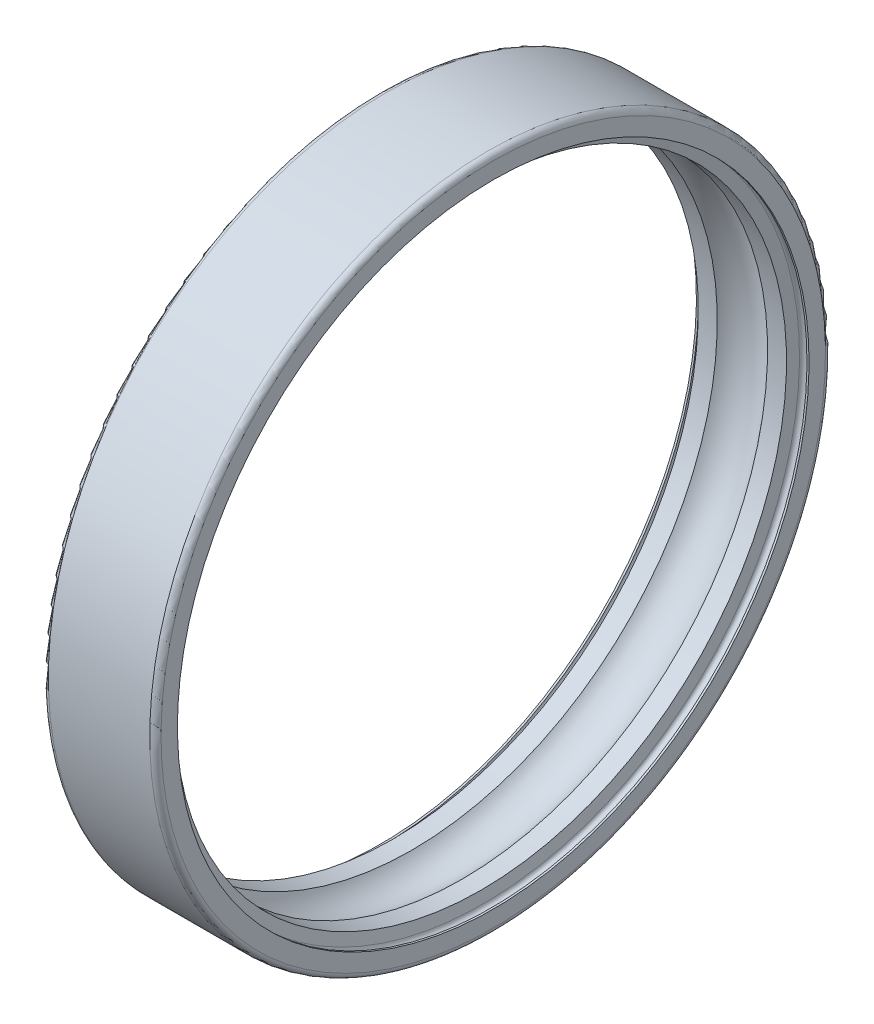
ISO-10303-21;
HEADER;
FILE_DESCRIPTION(('STEP AP214'),'2;1');
FILE_NAME('part.step','',(''),(''),'','','');
FILE_SCHEMA(('AUTOMOTIVE_DESIGN { 1 0 10303 214 1 1 1 1 }'));
ENDSEC;
DATA;
#1=APPLICATION_CONTEXT('core data for automotive mechanical design processes');
#2=APPLICATION_PROTOCOL_DEFINITION('international standard','automotive_design',2000,#1);
#3=PRODUCT_CONTEXT('',#1,'mechanical');
#4=PRODUCT('Part','Part','',(#3));
#5=PRODUCT_RELATED_PRODUCT_CATEGORY('part','',(#4));
#6=PRODUCT_DEFINITION_FORMATION('','',#4);
#7=PRODUCT_DEFINITION_CONTEXT('part definition',#1,'design');
#8=PRODUCT_DEFINITION('design','',#6,#7);
#9=PRODUCT_DEFINITION_SHAPE('','',#8);
#10=(LENGTH_UNIT() NAMED_UNIT(*) SI_UNIT(.MILLI.,.METRE.));
#11=(NAMED_UNIT(*) PLANE_ANGLE_UNIT() SI_UNIT($,.RADIAN.));
#12=(NAMED_UNIT(*) SI_UNIT($,.STERADIAN.) SOLID_ANGLE_UNIT());
#13=UNCERTAINTY_MEASURE_WITH_UNIT(LENGTH_MEASURE(1.E-05),#10,'distance_accuracy_value','');
#14=(GEOMETRIC_REPRESENTATION_CONTEXT(3) GLOBAL_UNCERTAINTY_ASSIGNED_CONTEXT((#13)) GLOBAL_UNIT_ASSIGNED_CONTEXT((#10,
#11,#12)) REPRESENTATION_CONTEXT('',''));
#15=CARTESIAN_POINT('',(0.,0.,0.));
#16=DIRECTION('',(0.,0.,1.));
#17=DIRECTION('',(1.,0.,0.));
#18=AXIS2_PLACEMENT_3D('',#15,#16,#17);
#19=CARTESIAN_POINT('',(11.34,0.,0.));
#20=DIRECTION('',(1.,0.,0.));
#21=DIRECTION('',(0.,0.,-1.));
#22=AXIS2_PLACEMENT_3D('',#19,#20,#21);
#23=TOROIDAL_SURFACE('',#22,33.65,0.44);
#24=CARTESIAN_POINT('',(11.78,0.,0.));
#25=DIRECTION('',(1.,0.,0.));
#26=DIRECTION('',(0.,1.,0.));
#27=AXIS2_PLACEMENT_3D('',#24,#25,#26);
#28=CIRCLE('',#27,33.65);
#29=CARTESIAN_POINT('',(11.78,33.65,0.));
#30=VERTEX_POINT('',#29);
#31=EDGE_CURVE('E11',#30,#30,#28,.T.);
#32=ORIENTED_EDGE('',*,*,#31,.T.);
#33=EDGE_LOOP('',(#32));
#34=FACE_BOUND('',#33,.T.);
#35=CARTESIAN_POINT('',(10.9066845886746,0.,0.));
#36=DIRECTION('',(1.,0.,0.));
#37=DIRECTION('',(0.,1.,0.));
#38=AXIS2_PLACEMENT_3D('',#35,#36,#37);
#39=CIRCLE('',#38,33.7264051981735);
#40=CARTESIAN_POINT('',(10.9066845886746,33.7264051981735,0.));
#41=VERTEX_POINT('',#40);
#42=EDGE_CURVE('E76',#41,#41,#39,.T.);
#43=ORIENTED_EDGE('',*,*,#42,.F.);
#44=EDGE_LOOP('',(#43));
#45=FACE_BOUND('',#44,.T.);
#46=ADVANCED_FACE('F16',(#34,#45),#23,.F.);
#47=CARTESIAN_POINT('',(11.89,0.,0.));
#48=DIRECTION('',(-1.,0.,0.));
#49=DIRECTION('',(0.,1.,0.));
#50=AXIS2_PLACEMENT_3D('',#47,#48,#49);
#51=CYLINDRICAL_SURFACE('',#50,33.65);
#52=CARTESIAN_POINT('',(12.,0.,0.));
#53=DIRECTION('',(1.,0.,0.));
#54=DIRECTION('',(0.,1.,0.));
#55=AXIS2_PLACEMENT_3D('',#52,#53,#54);
#56=CIRCLE('',#55,33.65);
#57=CARTESIAN_POINT('',(12.,33.65,0.));
#58=VERTEX_POINT('',#57);
#59=EDGE_CURVE('E26',#58,#58,#56,.T.);
#60=ORIENTED_EDGE('',*,*,#59,.T.);
#61=EDGE_LOOP('',(#60));
#62=FACE_BOUND('',#61,.T.);
#63=ORIENTED_EDGE('',*,*,#31,.F.);
#64=EDGE_LOOP('',(#63));
#65=FACE_BOUND('',#64,.T.);
#66=ADVANCED_FACE('F100',(#62,#65),#51,.F.);
#67=CARTESIAN_POINT('',(12.,34.525,0.));
#68=DIRECTION('',(1.,0.,0.));
#69=DIRECTION('',(0.,1.,0.));
#70=AXIS2_PLACEMENT_3D('',#67,#68,#69);
#71=PLANE('',#70);
#72=CARTESIAN_POINT('',(12.,0.,0.));
#73=DIRECTION('',(1.,0.,0.));
#74=DIRECTION('',(0.,1.,0.));
#75=AXIS2_PLACEMENT_3D('',#72,#73,#74);
#76=CIRCLE('',#75,35.4);
#77=CARTESIAN_POINT('',(12.,35.4,0.));
#78=VERTEX_POINT('',#77);
#79=EDGE_CURVE('E54',#78,#78,#76,.T.);
#80=ORIENTED_EDGE('',*,*,#79,.T.);
#81=EDGE_LOOP('',(#80));
#82=FACE_BOUND('',#81,.T.);
#83=ORIENTED_EDGE('',*,*,#59,.F.);
#84=EDGE_LOOP('',(#83));
#85=FACE_BOUND('',#84,.T.);
#86=ADVANCED_FACE('F103',(#82,#85),#71,.T.);
#87=CARTESIAN_POINT('',(11.4,0.,0.));
#88=DIRECTION('',(1.,0.,0.));
#89=DIRECTION('',(0.,0.,-1.));
#90=AXIS2_PLACEMENT_3D('',#87,#88,#89);
#91=TOROIDAL_SURFACE('',#90,35.4,0.6);
#92=CARTESIAN_POINT('',(11.4,0.,0.));
#93=DIRECTION('',(1.,0.,0.));
#94=DIRECTION('',(0.,1.,0.));
#95=AXIS2_PLACEMENT_3D('',#92,#93,#94);
#96=CIRCLE('',#95,36.);
#97=CARTESIAN_POINT('',(11.4,36.,0.));
#98=VERTEX_POINT('',#97);
#99=EDGE_CURVE('E20',#98,#98,#96,.T.);
#100=ORIENTED_EDGE('',*,*,#99,.T.);
#101=EDGE_LOOP('',(#100));
#102=FACE_BOUND('',#101,.T.);
#103=ORIENTED_EDGE('',*,*,#79,.F.);
#104=EDGE_LOOP('',(#103));
#105=FACE_BOUND('',#104,.T.);
#106=ADVANCED_FACE('F105',(#102,#105),#91,.T.);
#107=CARTESIAN_POINT('',(6.,0.,0.));
#108=DIRECTION('',(-1.,0.,0.));
#109=DIRECTION('',(0.,1.,0.));
#110=AXIS2_PLACEMENT_3D('',#107,#108,#109);
#111=CYLINDRICAL_SURFACE('',#110,36.);
#112=CARTESIAN_POINT('',(0.6,0.,0.));
#113=DIRECTION('',(1.,0.,0.));
#114=DIRECTION('',(0.,1.,0.));
#115=AXIS2_PLACEMENT_3D('',#112,#113,#114);
#116=CIRCLE('',#115,36.);
#117=CARTESIAN_POINT('',(0.6,36.,0.));
#118=VERTEX_POINT('',#117);
#119=EDGE_CURVE('E80',#118,#118,#116,.T.);
#120=ORIENTED_EDGE('',*,*,#119,.T.);
#121=EDGE_LOOP('',(#120));
#122=FACE_BOUND('',#121,.T.);
#123=ORIENTED_EDGE('',*,*,#99,.F.);
#124=EDGE_LOOP('',(#123));
#125=FACE_BOUND('',#124,.T.);
#126=ADVANCED_FACE('F112',(#122,#125),#111,.T.);
#127=CARTESIAN_POINT('',(0.6,0.,0.));
#128=DIRECTION('',(1.,0.,0.));
#129=DIRECTION('',(0.,0.,-1.));
#130=AXIS2_PLACEMENT_3D('',#127,#128,#129);
#131=TOROIDAL_SURFACE('',#130,35.4,0.6);
#132=CARTESIAN_POINT('',(0.,0.,0.));
#133=DIRECTION('',(1.,0.,0.));
#134=DIRECTION('',(0.,1.,0.));
#135=AXIS2_PLACEMENT_3D('',#132,#133,#134);
#136=CIRCLE('',#135,35.4);
#137=CARTESIAN_POINT('',(0.,35.4,0.));
#138=VERTEX_POINT('',#137);
#139=EDGE_CURVE('E82',#138,#138,#136,.T.);
#140=ORIENTED_EDGE('',*,*,#139,.T.);
#141=EDGE_LOOP('',(#140));
#142=FACE_BOUND('',#141,.T.);
#143=ORIENTED_EDGE('',*,*,#119,.F.);
#144=EDGE_LOOP('',(#143));
#145=FACE_BOUND('',#144,.T.);
#146=ADVANCED_FACE('F150',(#142,#145),#131,.T.);
#147=CARTESIAN_POINT('',(0.,34.525,0.));
#148=DIRECTION('',(-1.,0.,0.));
#149=DIRECTION('',(0.,-1.,0.));
#150=AXIS2_PLACEMENT_3D('',#147,#148,#149);
#151=PLANE('',#150);
#152=CARTESIAN_POINT('',(0.,0.,0.));
#153=DIRECTION('',(1.,0.,0.));
#154=DIRECTION('',(0.,1.,0.));
#155=AXIS2_PLACEMENT_3D('',#152,#153,#154);
#156=CIRCLE('',#155,33.65);
#157=CARTESIAN_POINT('',(0.,33.65,0.));
#158=VERTEX_POINT('',#157);
#159=EDGE_CURVE('E83',#158,#158,#156,.T.);
#160=ORIENTED_EDGE('',*,*,#159,.T.);
#161=EDGE_LOOP('',(#160));
#162=FACE_BOUND('',#161,.T.);
#163=ORIENTED_EDGE('',*,*,#139,.F.);
#164=EDGE_LOOP('',(#163));
#165=FACE_BOUND('',#164,.T.);
#166=ADVANCED_FACE('F139',(#162,#165),#151,.T.);
#167=CARTESIAN_POINT('',(0.11,0.,0.));
#168=DIRECTION('',(-1.,0.,0.));
#169=DIRECTION('',(0.,1.,0.));
#170=AXIS2_PLACEMENT_3D('',#167,#168,#169);
#171=CYLINDRICAL_SURFACE('',#170,33.65);
#172=CARTESIAN_POINT('',(0.22,0.,0.));
#173=DIRECTION('',(1.,0.,0.));
#174=DIRECTION('',(0.,1.,0.));
#175=AXIS2_PLACEMENT_3D('',#172,#173,#174);
#176=CIRCLE('',#175,33.65);
#177=CARTESIAN_POINT('',(0.22,33.65,0.));
#178=VERTEX_POINT('',#177);
#179=EDGE_CURVE('E90',#178,#178,#176,.T.);
#180=ORIENTED_EDGE('',*,*,#179,.T.);
#181=EDGE_LOOP('',(#180));
#182=FACE_BOUND('',#181,.T.);
#183=ORIENTED_EDGE('',*,*,#159,.F.);
#184=EDGE_LOOP('',(#183));
#185=FACE_BOUND('',#184,.T.);
#186=ADVANCED_FACE('F130',(#182,#185),#171,.F.);
#187=CARTESIAN_POINT('',(0.66,0.,0.));
#188=DIRECTION('',(1.,0.,0.));
#189=DIRECTION('',(0.,0.,-1.));
#190=AXIS2_PLACEMENT_3D('',#187,#188,#189);
#191=TOROIDAL_SURFACE('',#190,33.65,0.44);
#192=CARTESIAN_POINT('',(1.09331541132537,0.,0.));
#193=DIRECTION('',(1.,0.,0.));
#194=DIRECTION('',(0.,1.,0.));
#195=AXIS2_PLACEMENT_3D('',#192,#193,#194);
#196=CIRCLE('',#195,33.7264051981735);
#197=CARTESIAN_POINT('',(1.09331541132537,33.7264051981735,0.));
#198=VERTEX_POINT('',#197);
#199=EDGE_CURVE('E89',#198,#198,#196,.T.);
#200=ORIENTED_EDGE('',*,*,#199,.T.);
#201=EDGE_LOOP('',(#200));
#202=FACE_BOUND('',#201,.T.);
#203=ORIENTED_EDGE('',*,*,#179,.F.);
#204=EDGE_LOOP('',(#203));
#205=FACE_BOUND('',#204,.T.);
#206=ADVANCED_FACE('F127',(#202,#205),#191,.F.);
#207=CARTESIAN_POINT('',(1.1970313996672,0.,0.));
#208=DIRECTION('',(-1.,0.,0.));
#209=DIRECTION('',(0.,1.,0.));
#210=AXIS2_PLACEMENT_3D('',#207,#208,#209);
#211=CONICAL_SURFACE('',#210,33.1382025990868,1.39626340159546);
#212=CARTESIAN_POINT('',(1.30074738800904,0.,0.));
#213=DIRECTION('',(1.,0.,0.));
#214=DIRECTION('',(0.,1.,0.));
#215=AXIS2_PLACEMENT_3D('',#212,#213,#214);
#216=CIRCLE('',#215,32.55);
#217=CARTESIAN_POINT('',(1.30074738800904,32.55,0.));
#218=VERTEX_POINT('',#217);
#219=EDGE_CURVE('E87',#218,#218,#216,.T.);
#220=ORIENTED_EDGE('',*,*,#219,.T.);
#221=EDGE_LOOP('',(#220));
#222=FACE_BOUND('',#221,.T.);
#223=ORIENTED_EDGE('',*,*,#199,.F.);
#224=EDGE_LOOP('',(#223));
#225=FACE_BOUND('',#224,.T.);
#226=ADVANCED_FACE('F129',(#222,#225),#211,.F.);
#227=CARTESIAN_POINT('',(2.31078399469357,0.,0.));
#228=DIRECTION('',(-1.,0.,0.));
#229=DIRECTION('',(0.,1.,0.));
#230=AXIS2_PLACEMENT_3D('',#227,#228,#229);
#231=CYLINDRICAL_SURFACE('',#230,32.55);
#232=CARTESIAN_POINT('',(3.32082060137811,0.,0.));
#233=DIRECTION('',(1.,0.,0.));
#234=DIRECTION('',(0.,1.,0.));
#235=AXIS2_PLACEMENT_3D('',#232,#233,#234);
#236=CIRCLE('',#235,32.55);
#237=CARTESIAN_POINT('',(3.32082060137811,32.55,0.));
#238=VERTEX_POINT('',#237);
#239=EDGE_CURVE('E86',#238,#238,#236,.T.);
#240=ORIENTED_EDGE('',*,*,#239,.T.);
#241=EDGE_LOOP('',(#240));
#242=FACE_BOUND('',#241,.T.);
#243=ORIENTED_EDGE('',*,*,#219,.F.);
#244=EDGE_LOOP('',(#243));
#245=FACE_BOUND('',#244,.T.);
#246=ADVANCED_FACE('F136',(#242,#245),#231,.F.);
#247=CARTESIAN_POINT('',(6.,0.,0.));
#248=DIRECTION('',(1.,0.,0.));
#249=DIRECTION('',(0.,0.,-1.));
#250=AXIS2_PLACEMENT_3D('',#247,#248,#249);
#251=TOROIDAL_SURFACE('',#250,30.5,3.3735);
#252=CARTESIAN_POINT('',(8.67917939862189,0.,0.));
#253=DIRECTION('',(1.,0.,0.));
#254=DIRECTION('',(0.,1.,0.));
#255=AXIS2_PLACEMENT_3D('',#252,#253,#254);
#256=CIRCLE('',#255,32.55);
#257=CARTESIAN_POINT('',(8.67917939862189,32.55,0.));
#258=VERTEX_POINT('',#257);
#259=EDGE_CURVE('E77',#258,#258,#256,.T.);
#260=ORIENTED_EDGE('',*,*,#259,.T.);
#261=EDGE_LOOP('',(#260));
#262=FACE_BOUND('',#261,.T.);
#263=ORIENTED_EDGE('',*,*,#239,.F.);
#264=EDGE_LOOP('',(#263));
#265=FACE_BOUND('',#264,.T.);
#266=ADVANCED_FACE('F18',(#262,#265),#251,.F.);
#267=CARTESIAN_POINT('',(9.68921600530643,0.,0.));
#268=DIRECTION('',(-1.,0.,0.));
#269=DIRECTION('',(0.,1.,0.));
#270=AXIS2_PLACEMENT_3D('',#267,#268,#269);
#271=CYLINDRICAL_SURFACE('',#270,32.55);
#272=CARTESIAN_POINT('',(10.699252611991,0.,0.));
#273=DIRECTION('',(1.,0.,0.));
#274=DIRECTION('',(0.,1.,0.));
#275=AXIS2_PLACEMENT_3D('',#272,#273,#274);
#276=CIRCLE('',#275,32.55);
#277=CARTESIAN_POINT('',(10.699252611991,32.55,0.));
#278=VERTEX_POINT('',#277);
#279=EDGE_CURVE('E72',#278,#278,#276,.T.);
#280=ORIENTED_EDGE('',*,*,#279,.T.);
#281=EDGE_LOOP('',(#280));
#282=FACE_BOUND('',#281,.T.);
#283=ORIENTED_EDGE('',*,*,#259,.F.);
#284=EDGE_LOOP('',(#283));
#285=FACE_BOUND('',#284,.T.);
#286=ADVANCED_FACE('F73',(#282,#285),#271,.F.);
#287=CARTESIAN_POINT('',(10.8029686003328,0.,0.));
#288=DIRECTION('',(1.,0.,0.));
#289=DIRECTION('',(0.,1.,0.));
#290=AXIS2_PLACEMENT_3D('',#287,#288,#289);
#291=CONICAL_SURFACE('',#290,33.1382025990868,1.39626340159547);
#292=ORIENTED_EDGE('',*,*,#42,.T.);
#293=EDGE_LOOP('',(#292));
#294=FACE_BOUND('',#293,.T.);
#295=ORIENTED_EDGE('',*,*,#279,.F.);
#296=EDGE_LOOP('',(#295));
#297=FACE_BOUND('',#296,.T.);
#298=ADVANCED_FACE('F122',(#294,#297),#291,.F.);
#299=CLOSED_SHELL('',(#46,#66,#86,#106,#126,#146,#166,#186,#206,#226,#246,#266,#286,#298));
#300=MANIFOLD_SOLID_BREP('B1',#299);
#301=ADVANCED_BREP_SHAPE_REPRESENTATION('',(#18,#300),#14);
#302=SHAPE_DEFINITION_REPRESENTATION(#9,#301);
ENDSEC;
END-ISO-10303-21;
